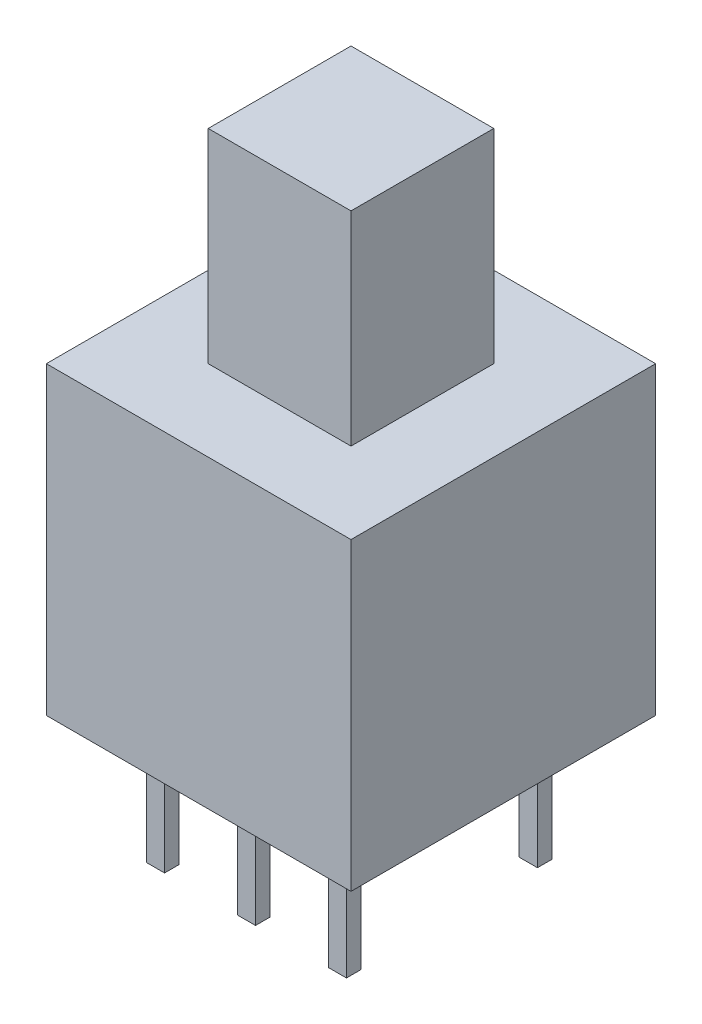
ISO-10303-21;
HEADER;
FILE_DESCRIPTION(('STEP AP214'),'2;1');
FILE_NAME('part.step','',(''),(''),'','','');
FILE_SCHEMA(('AUTOMOTIVE_DESIGN { 1 0 10303 214 1 1 1 1 }'));
ENDSEC;
DATA;
#1=APPLICATION_CONTEXT('core data for automotive mechanical design processes');
#2=APPLICATION_PROTOCOL_DEFINITION('international standard','automotive_design',2000,#1);
#3=PRODUCT_CONTEXT('',#1,'mechanical');
#4=PRODUCT('Part','Part','',(#3));
#5=PRODUCT_RELATED_PRODUCT_CATEGORY('part','',(#4));
#6=PRODUCT_DEFINITION_FORMATION('','',#4);
#7=PRODUCT_DEFINITION_CONTEXT('part definition',#1,'design');
#8=PRODUCT_DEFINITION('design','',#6,#7);
#9=PRODUCT_DEFINITION_SHAPE('','',#8);
#10=(LENGTH_UNIT() NAMED_UNIT(*) SI_UNIT(.MILLI.,.METRE.));
#11=(NAMED_UNIT(*) PLANE_ANGLE_UNIT() SI_UNIT($,.RADIAN.));
#12=(NAMED_UNIT(*) SI_UNIT($,.STERADIAN.) SOLID_ANGLE_UNIT());
#13=UNCERTAINTY_MEASURE_WITH_UNIT(LENGTH_MEASURE(1.E-05),#10,'distance_accuracy_value','');
#14=(GEOMETRIC_REPRESENTATION_CONTEXT(3) GLOBAL_UNCERTAINTY_ASSIGNED_CONTEXT((#13)) GLOBAL_UNIT_ASSIGNED_CONTEXT((#10,
#11,#12)) REPRESENTATION_CONTEXT('',''));
#15=CARTESIAN_POINT('',(0.,0.,0.));
#16=DIRECTION('',(0.,0.,1.));
#17=DIRECTION('',(1.,0.,0.));
#18=AXIS2_PLACEMENT_3D('',#15,#16,#17);
#19=CARTESIAN_POINT('',(0.,0.,0.));
#20=DIRECTION('',(0.,-1.,0.));
#21=DIRECTION('',(0.,0.,-1.));
#22=AXIS2_PLACEMENT_3D('',#19,#20,#21);
#23=PLANE('',#22);
#24=DIRECTION('',(0.,0.,1.));
#25=VECTOR('',#24,1.);
#26=CARTESIAN_POINT('',(0.,0.,0.));
#27=LINE('',#26,#25);
#28=CARTESIAN_POINT('',(0.,0.,-8.509));
#29=VERTEX_POINT('',#28);
#30=CARTESIAN_POINT('',(0.,0.,0.));
#31=VERTEX_POINT('',#30);
#32=EDGE_CURVE('E448',#29,#31,#27,.T.);
#33=ORIENTED_EDGE('',*,*,#32,.F.);
#34=DIRECTION('',(-1.,0.,0.));
#35=VECTOR('',#34,1.);
#36=CARTESIAN_POINT('',(0.,0.,-8.509));
#37=LINE('',#36,#35);
#38=CARTESIAN_POINT('',(8.509,0.,-8.509));
#39=VERTEX_POINT('',#38);
#40=EDGE_CURVE('E453',#39,#29,#37,.T.);
#41=ORIENTED_EDGE('',*,*,#40,.F.);
#42=DIRECTION('',(0.,0.,-1.));
#43=VECTOR('',#42,1.);
#44=CARTESIAN_POINT('',(8.509,0.,0.));
#45=LINE('',#44,#43);
#46=CARTESIAN_POINT('',(8.509,0.,0.));
#47=VERTEX_POINT('',#46);
#48=EDGE_CURVE('E464',#47,#39,#45,.T.);
#49=ORIENTED_EDGE('',*,*,#48,.F.);
#50=DIRECTION('',(1.,0.,0.));
#51=VECTOR('',#50,1.);
#52=CARTESIAN_POINT('',(0.,0.,0.));
#53=LINE('',#52,#51);
#54=EDGE_CURVE('E462',#31,#47,#53,.T.);
#55=ORIENTED_EDGE('',*,*,#54,.F.);
#56=EDGE_LOOP('',(#33,#41,#49,#55));
#57=FACE_BOUND('',#56,.T.);
#58=DIRECTION('',(1.,0.,0.));
#59=VECTOR('',#58,1.);
#60=CARTESIAN_POINT('',(1.4478,0.,-1.7526));
#61=LINE('',#60,#59);
#62=CARTESIAN_POINT('',(1.4478,0.,-1.7526));
#63=VERTEX_POINT('',#62);
#64=CARTESIAN_POINT('',(1.9558,0.,-1.7526));
#65=VERTEX_POINT('',#64);
#66=EDGE_CURVE('E400',#63,#65,#61,.T.);
#67=ORIENTED_EDGE('',*,*,#66,.F.);
#68=DIRECTION('',(0.,0.,-1.));
#69=VECTOR('',#68,1.);
#70=CARTESIAN_POINT('',(1.4478,0.,-1.3462));
#71=LINE('',#70,#69);
#72=CARTESIAN_POINT('',(1.4478,0.,-1.3462));
#73=VERTEX_POINT('',#72);
#74=EDGE_CURVE('E386',#73,#63,#71,.T.);
#75=ORIENTED_EDGE('',*,*,#74,.F.);
#76=DIRECTION('',(-1.,0.,0.));
#77=VECTOR('',#76,1.);
#78=CARTESIAN_POINT('',(1.4478,0.,-1.3462));
#79=LINE('',#78,#77);
#80=CARTESIAN_POINT('',(1.9558,0.,-1.3462));
#81=VERTEX_POINT('',#80);
#82=EDGE_CURVE('E391',#81,#73,#79,.T.);
#83=ORIENTED_EDGE('',*,*,#82,.F.);
#84=DIRECTION('',(0.,0.,1.));
#85=VECTOR('',#84,1.);
#86=CARTESIAN_POINT('',(1.9558,0.,-1.3462));
#87=LINE('',#86,#85);
#88=EDGE_CURVE('E402',#65,#81,#87,.T.);
#89=ORIENTED_EDGE('',*,*,#88,.F.);
#90=EDGE_LOOP('',(#67,#75,#83,#89));
#91=FACE_BOUND('',#90,.T.);
#92=DIRECTION('',(0.,0.,-1.));
#93=VECTOR('',#92,1.);
#94=CARTESIAN_POINT('',(1.4478,0.,-6.6802));
#95=LINE('',#94,#93);
#96=CARTESIAN_POINT('',(1.4478,0.,-6.6802));
#97=VERTEX_POINT('',#96);
#98=CARTESIAN_POINT('',(1.4478,0.,-7.0866));
#99=VERTEX_POINT('',#98);
#100=EDGE_CURVE('E371',#97,#99,#95,.T.);
#101=ORIENTED_EDGE('',*,*,#100,.F.);
#102=DIRECTION('',(-1.,0.,0.));
#103=VECTOR('',#102,1.);
#104=CARTESIAN_POINT('',(1.4478,0.,-6.6802));
#105=LINE('',#104,#103);
#106=CARTESIAN_POINT('',(1.9558,0.,-6.6802));
#107=VERTEX_POINT('',#106);
#108=EDGE_CURVE('E357',#107,#97,#105,.T.);
#109=ORIENTED_EDGE('',*,*,#108,.F.);
#110=DIRECTION('',(0.,0.,1.));
#111=VECTOR('',#110,1.);
#112=CARTESIAN_POINT('',(1.9558,0.,-6.6802));
#113=LINE('',#112,#111);
#114=CARTESIAN_POINT('',(1.9558,0.,-7.0866));
#115=VERTEX_POINT('',#114);
#116=EDGE_CURVE('E362',#115,#107,#113,.T.);
#117=ORIENTED_EDGE('',*,*,#116,.F.);
#118=DIRECTION('',(1.,0.,0.));
#119=VECTOR('',#118,1.);
#120=CARTESIAN_POINT('',(1.4478,0.,-7.0866));
#121=LINE('',#120,#119);
#122=EDGE_CURVE('E373',#99,#115,#121,.T.);
#123=ORIENTED_EDGE('',*,*,#122,.F.);
#124=EDGE_LOOP('',(#101,#109,#117,#123));
#125=FACE_BOUND('',#124,.T.);
#126=DIRECTION('',(0.,0.,-1.));
#127=VECTOR('',#126,1.);
#128=CARTESIAN_POINT('',(3.9878,0.,-6.6802));
#129=LINE('',#128,#127);
#130=CARTESIAN_POINT('',(3.9878,0.,-6.6802));
#131=VERTEX_POINT('',#130);
#132=CARTESIAN_POINT('',(3.9878,0.,-7.0866));
#133=VERTEX_POINT('',#132);
#134=EDGE_CURVE('E342',#131,#133,#129,.T.);
#135=ORIENTED_EDGE('',*,*,#134,.F.);
#136=DIRECTION('',(-1.,0.,0.));
#137=VECTOR('',#136,1.);
#138=CARTESIAN_POINT('',(3.9878,0.,-6.6802));
#139=LINE('',#138,#137);
#140=CARTESIAN_POINT('',(4.4958,0.,-6.6802));
#141=VERTEX_POINT('',#140);
#142=EDGE_CURVE('E328',#141,#131,#139,.T.);
#143=ORIENTED_EDGE('',*,*,#142,.F.);
#144=DIRECTION('',(0.,0.,1.));
#145=VECTOR('',#144,1.);
#146=CARTESIAN_POINT('',(4.4958,0.,-6.6802));
#147=LINE('',#146,#145);
#148=CARTESIAN_POINT('',(4.4958,0.,-7.0866));
#149=VERTEX_POINT('',#148);
#150=EDGE_CURVE('E333',#149,#141,#147,.T.);
#151=ORIENTED_EDGE('',*,*,#150,.F.);
#152=DIRECTION('',(1.,0.,0.));
#153=VECTOR('',#152,1.);
#154=CARTESIAN_POINT('',(3.9878,0.,-7.0866));
#155=LINE('',#154,#153);
#156=EDGE_CURVE('E344',#133,#149,#155,.T.);
#157=ORIENTED_EDGE('',*,*,#156,.F.);
#158=EDGE_LOOP('',(#135,#143,#151,#157));
#159=FACE_BOUND('',#158,.T.);
#160=DIRECTION('',(0.,0.,-1.));
#161=VECTOR('',#160,1.);
#162=CARTESIAN_POINT('',(6.5278,0.,-6.6802));
#163=LINE('',#162,#161);
#164=CARTESIAN_POINT('',(6.5278,0.,-6.6802));
#165=VERTEX_POINT('',#164);
#166=CARTESIAN_POINT('',(6.5278,0.,-7.0866));
#167=VERTEX_POINT('',#166);
#168=EDGE_CURVE('E313',#165,#167,#163,.T.);
#169=ORIENTED_EDGE('',*,*,#168,.F.);
#170=DIRECTION('',(-1.,0.,0.));
#171=VECTOR('',#170,1.);
#172=CARTESIAN_POINT('',(6.5278,0.,-6.6802));
#173=LINE('',#172,#171);
#174=CARTESIAN_POINT('',(7.0358,0.,-6.6802));
#175=VERTEX_POINT('',#174);
#176=EDGE_CURVE('E299',#175,#165,#173,.T.);
#177=ORIENTED_EDGE('',*,*,#176,.F.);
#178=DIRECTION('',(0.,0.,1.));
#179=VECTOR('',#178,1.);
#180=CARTESIAN_POINT('',(7.0358,0.,-6.6802));
#181=LINE('',#180,#179);
#182=CARTESIAN_POINT('',(7.0358,0.,-7.0866));
#183=VERTEX_POINT('',#182);
#184=EDGE_CURVE('E304',#183,#175,#181,.T.);
#185=ORIENTED_EDGE('',*,*,#184,.F.);
#186=DIRECTION('',(1.,0.,0.));
#187=VECTOR('',#186,1.);
#188=CARTESIAN_POINT('',(6.5278,0.,-7.0866));
#189=LINE('',#188,#187);
#190=EDGE_CURVE('E315',#167,#183,#189,.T.);
#191=ORIENTED_EDGE('',*,*,#190,.F.);
#192=EDGE_LOOP('',(#169,#177,#185,#191));
#193=FACE_BOUND('',#192,.T.);
#194=DIRECTION('',(0.,0.,-1.));
#195=VECTOR('',#194,1.);
#196=CARTESIAN_POINT('',(3.9878,0.,-1.3462));
#197=LINE('',#196,#195);
#198=CARTESIAN_POINT('',(3.9878,0.,-1.3462));
#199=VERTEX_POINT('',#198);
#200=CARTESIAN_POINT('',(3.9878,0.,-1.7526));
#201=VERTEX_POINT('',#200);
#202=EDGE_CURVE('E271',#199,#201,#197,.T.);
#203=ORIENTED_EDGE('',*,*,#202,.F.);
#204=DIRECTION('',(-1.,0.,0.));
#205=VECTOR('',#204,1.);
#206=CARTESIAN_POINT('',(3.9878,0.,-1.3462));
#207=LINE('',#206,#205);
#208=CARTESIAN_POINT('',(4.4958,0.,-1.3462));
#209=VERTEX_POINT('',#208);
#210=EDGE_CURVE('E268',#209,#199,#207,.T.);
#211=ORIENTED_EDGE('',*,*,#210,.F.);
#212=DIRECTION('',(0.,0.,1.));
#213=VECTOR('',#212,1.);
#214=CARTESIAN_POINT('',(4.4958,0.,-1.3462));
#215=LINE('',#214,#213);
#216=CARTESIAN_POINT('',(4.4958,0.,-1.7526));
#217=VERTEX_POINT('',#216);
#218=EDGE_CURVE('E280',#217,#209,#215,.T.);
#219=ORIENTED_EDGE('',*,*,#218,.F.);
#220=DIRECTION('',(1.,0.,0.));
#221=VECTOR('',#220,1.);
#222=CARTESIAN_POINT('',(3.9878,0.,-1.7526));
#223=LINE('',#222,#221);
#224=EDGE_CURVE('E288',#201,#217,#223,.T.);
#225=ORIENTED_EDGE('',*,*,#224,.F.);
#226=EDGE_LOOP('',(#203,#211,#219,#225));
#227=FACE_BOUND('',#226,.T.);
#228=DIRECTION('',(0.,0.,-1.));
#229=VECTOR('',#228,1.);
#230=CARTESIAN_POINT('',(6.5278,0.,-1.3462));
#231=LINE('',#230,#229);
#232=CARTESIAN_POINT('',(6.5278,0.,-1.3462));
#233=VERTEX_POINT('',#232);
#234=CARTESIAN_POINT('',(6.5278,0.,-1.7526));
#235=VERTEX_POINT('',#234);
#236=EDGE_CURVE('E889',#233,#235,#231,.T.);
#237=ORIENTED_EDGE('',*,*,#236,.F.);
#238=DIRECTION('',(-1.,0.,0.));
#239=VECTOR('',#238,1.);
#240=CARTESIAN_POINT('',(6.5278,0.,-1.3462));
#241=LINE('',#240,#239);
#242=CARTESIAN_POINT('',(7.0358,0.,-1.3462));
#243=VERTEX_POINT('',#242);
#244=EDGE_CURVE('E266',#243,#233,#241,.T.);
#245=ORIENTED_EDGE('',*,*,#244,.F.);
#246=DIRECTION('',(0.,0.,1.));
#247=VECTOR('',#246,1.);
#248=CARTESIAN_POINT('',(7.0358,0.,-1.3462));
#249=LINE('',#248,#247);
#250=CARTESIAN_POINT('',(7.0358,0.,-1.7526));
#251=VERTEX_POINT('',#250);
#252=EDGE_CURVE('E262',#251,#243,#249,.T.);
#253=ORIENTED_EDGE('',*,*,#252,.F.);
#254=DIRECTION('',(1.,0.,0.));
#255=VECTOR('',#254,1.);
#256=CARTESIAN_POINT('',(6.5278,0.,-1.7526));
#257=LINE('',#256,#255);
#258=EDGE_CURVE('E886',#235,#251,#257,.T.);
#259=ORIENTED_EDGE('',*,*,#258,.F.);
#260=EDGE_LOOP('',(#237,#245,#253,#259));
#261=FACE_BOUND('',#260,.T.);
#262=ADVANCED_FACE('F33',(#57,#91,#125,#159,#193,#227,#261),#23,.T.);
#263=CARTESIAN_POINT('',(0.,8.509,0.));
#264=DIRECTION('',(0.,-1.,0.));
#265=DIRECTION('',(0.,0.,-1.));
#266=AXIS2_PLACEMENT_3D('',#263,#264,#265);
#267=PLANE('',#266);
#268=DIRECTION('',(0.,0.,1.));
#269=VECTOR('',#268,1.);
#270=CARTESIAN_POINT('',(0.,8.509,0.));
#271=LINE('',#270,#269);
#272=CARTESIAN_POINT('',(0.,8.509,-8.509));
#273=VERTEX_POINT('',#272);
#274=CARTESIAN_POINT('',(0.,8.509,0.));
#275=VERTEX_POINT('',#274);
#276=EDGE_CURVE('E449',#273,#275,#271,.T.);
#277=ORIENTED_EDGE('',*,*,#276,.T.);
#278=DIRECTION('',(1.,0.,0.));
#279=VECTOR('',#278,1.);
#280=CARTESIAN_POINT('',(0.,8.509,0.));
#281=LINE('',#280,#279);
#282=CARTESIAN_POINT('',(8.509,8.509,0.));
#283=VERTEX_POINT('',#282);
#284=EDGE_CURVE('E452',#275,#283,#281,.T.);
#285=ORIENTED_EDGE('',*,*,#284,.T.);
#286=DIRECTION('',(0.,0.,-1.));
#287=VECTOR('',#286,1.);
#288=CARTESIAN_POINT('',(8.509,8.509,0.));
#289=LINE('',#288,#287);
#290=CARTESIAN_POINT('',(8.509,8.509,-8.509));
#291=VERTEX_POINT('',#290);
#292=EDGE_CURVE('E455',#283,#291,#289,.T.);
#293=ORIENTED_EDGE('',*,*,#292,.T.);
#294=DIRECTION('',(-1.,0.,0.));
#295=VECTOR('',#294,1.);
#296=CARTESIAN_POINT('',(0.,8.509,-8.509));
#297=LINE('',#296,#295);
#298=EDGE_CURVE('E457',#291,#273,#297,.T.);
#299=ORIENTED_EDGE('',*,*,#298,.T.);
#300=EDGE_LOOP('',(#277,#285,#293,#299));
#301=FACE_BOUND('',#300,.T.);
#302=DIRECTION('',(0.,0.,1.));
#303=VECTOR('',#302,1.);
#304=CARTESIAN_POINT('',(2.2606,8.509,-6.2484));
#305=LINE('',#304,#303);
#306=CARTESIAN_POINT('',(2.2606,8.509,-6.2484));
#307=VERTEX_POINT('',#306);
#308=CARTESIAN_POINT('',(2.2606,8.509,-2.2606));
#309=VERTEX_POINT('',#308);
#310=EDGE_CURVE('E415',#307,#309,#305,.T.);
#311=ORIENTED_EDGE('',*,*,#310,.F.);
#312=DIRECTION('',(-1.,0.,0.));
#313=VECTOR('',#312,1.);
#314=CARTESIAN_POINT('',(2.2606,8.509,-6.2484));
#315=LINE('',#314,#313);
#316=CARTESIAN_POINT('',(6.2484,8.509,-6.2484));
#317=VERTEX_POINT('',#316);
#318=EDGE_CURVE('E420',#317,#307,#315,.T.);
#319=ORIENTED_EDGE('',*,*,#318,.F.);
#320=DIRECTION('',(0.,0.,-1.));
#321=VECTOR('',#320,1.);
#322=CARTESIAN_POINT('',(6.2484,8.509,-6.2484));
#323=LINE('',#322,#321);
#324=CARTESIAN_POINT('',(6.2484,8.509,-2.2606));
#325=VERTEX_POINT('',#324);
#326=EDGE_CURVE('E432',#325,#317,#323,.T.);
#327=ORIENTED_EDGE('',*,*,#326,.F.);
#328=DIRECTION('',(1.,0.,0.));
#329=VECTOR('',#328,1.);
#330=CARTESIAN_POINT('',(2.2606,8.509,-2.2606));
#331=LINE('',#330,#329);
#332=EDGE_CURVE('E429',#309,#325,#331,.T.);
#333=ORIENTED_EDGE('',*,*,#332,.F.);
#334=EDGE_LOOP('',(#311,#319,#327,#333));
#335=FACE_BOUND('',#334,.T.);
#336=ADVANCED_FACE('F491',(#301,#335),#267,.F.);
#337=CARTESIAN_POINT('',(0.,8.509,0.));
#338=DIRECTION('',(1.,0.,0.));
#339=DIRECTION('',(0.,0.,-1.));
#340=AXIS2_PLACEMENT_3D('',#337,#338,#339);
#341=PLANE('',#340);
#342=ORIENTED_EDGE('',*,*,#32,.T.);
#343=DIRECTION('',(0.,-1.,0.));
#344=VECTOR('',#343,1.);
#345=CARTESIAN_POINT('',(0.,8.509,0.));
#346=LINE('',#345,#344);
#347=EDGE_CURVE('E11',#275,#31,#346,.T.);
#348=ORIENTED_EDGE('',*,*,#347,.F.);
#349=ORIENTED_EDGE('',*,*,#276,.F.);
#350=DIRECTION('',(0.,-1.,0.));
#351=VECTOR('',#350,1.);
#352=CARTESIAN_POINT('',(0.,8.509,-8.509));
#353=LINE('',#352,#351);
#354=EDGE_CURVE('E459',#273,#29,#353,.T.);
#355=ORIENTED_EDGE('',*,*,#354,.T.);
#356=EDGE_LOOP('',(#342,#348,#349,#355));
#357=FACE_BOUND('',#356,.T.);
#358=ADVANCED_FACE('F35',(#357),#341,.F.);
#359=CARTESIAN_POINT('',(0.,8.509,0.));
#360=DIRECTION('',(0.,0.,-1.));
#361=DIRECTION('',(-1.,0.,0.));
#362=AXIS2_PLACEMENT_3D('',#359,#360,#361);
#363=PLANE('',#362);
#364=ORIENTED_EDGE('',*,*,#54,.T.);
#365=DIRECTION('',(0.,-1.,0.));
#366=VECTOR('',#365,1.);
#367=CARTESIAN_POINT('',(8.509,8.509,0.));
#368=LINE('',#367,#366);
#369=EDGE_CURVE('E41',#283,#47,#368,.T.);
#370=ORIENTED_EDGE('',*,*,#369,.F.);
#371=ORIENTED_EDGE('',*,*,#284,.F.);
#372=ORIENTED_EDGE('',*,*,#347,.T.);
#373=EDGE_LOOP('',(#364,#370,#371,#372));
#374=FACE_BOUND('',#373,.T.);
#375=ADVANCED_FACE('F493',(#374),#363,.F.);
#376=CARTESIAN_POINT('',(8.509,8.509,0.));
#377=DIRECTION('',(-1.,0.,0.));
#378=DIRECTION('',(0.,0.,1.));
#379=AXIS2_PLACEMENT_3D('',#376,#377,#378);
#380=PLANE('',#379);
#381=ORIENTED_EDGE('',*,*,#48,.T.);
#382=DIRECTION('',(0.,-1.,0.));
#383=VECTOR('',#382,1.);
#384=CARTESIAN_POINT('',(8.509,8.509,-8.509));
#385=LINE('',#384,#383);
#386=EDGE_CURVE('E469',#291,#39,#385,.T.);
#387=ORIENTED_EDGE('',*,*,#386,.F.);
#388=ORIENTED_EDGE('',*,*,#292,.F.);
#389=ORIENTED_EDGE('',*,*,#369,.T.);
#390=EDGE_LOOP('',(#381,#387,#388,#389));
#391=FACE_BOUND('',#390,.T.);
#392=ADVANCED_FACE('F476',(#391),#380,.F.);
#393=CARTESIAN_POINT('',(0.,8.509,-8.509));
#394=DIRECTION('',(0.,0.,1.));
#395=DIRECTION('',(1.,0.,0.));
#396=AXIS2_PLACEMENT_3D('',#393,#394,#395);
#397=PLANE('',#396);
#398=ORIENTED_EDGE('',*,*,#40,.T.);
#399=ORIENTED_EDGE('',*,*,#354,.F.);
#400=ORIENTED_EDGE('',*,*,#298,.F.);
#401=ORIENTED_EDGE('',*,*,#386,.T.);
#402=EDGE_LOOP('',(#398,#399,#400,#401));
#403=FACE_BOUND('',#402,.T.);
#404=ADVANCED_FACE('F485',(#403),#397,.F.);
#405=CARTESIAN_POINT('',(2.2606,14.1986,-6.2484));
#406=DIRECTION('',(1.,0.,0.));
#407=DIRECTION('',(0.,0.,-1.));
#408=AXIS2_PLACEMENT_3D('',#405,#406,#407);
#409=PLANE('',#408);
#410=ORIENTED_EDGE('',*,*,#310,.T.);
#411=DIRECTION('',(0.,-1.,0.));
#412=VECTOR('',#411,1.);
#413=CARTESIAN_POINT('',(2.2606,14.1986,-2.2606));
#414=LINE('',#413,#412);
#415=CARTESIAN_POINT('',(2.2606,14.1986,-2.2606));
#416=VERTEX_POINT('',#415);
#417=EDGE_CURVE('E445',#416,#309,#414,.T.);
#418=ORIENTED_EDGE('',*,*,#417,.F.);
#419=DIRECTION('',(0.,0.,1.));
#420=VECTOR('',#419,1.);
#421=CARTESIAN_POINT('',(2.2606,14.1986,-6.2484));
#422=LINE('',#421,#420);
#423=CARTESIAN_POINT('',(2.2606,14.1986,-6.2484));
#424=VERTEX_POINT('',#423);
#425=EDGE_CURVE('E416',#424,#416,#422,.T.);
#426=ORIENTED_EDGE('',*,*,#425,.F.);
#427=DIRECTION('',(0.,-1.,0.));
#428=VECTOR('',#427,1.);
#429=CARTESIAN_POINT('',(2.2606,14.1986,-6.2484));
#430=LINE('',#429,#428);
#431=EDGE_CURVE('E426',#424,#307,#430,.T.);
#432=ORIENTED_EDGE('',*,*,#431,.T.);
#433=EDGE_LOOP('',(#410,#418,#426,#432));
#434=FACE_BOUND('',#433,.T.);
#435=ADVANCED_FACE('F509',(#434),#409,.F.);
#436=CARTESIAN_POINT('',(2.2606,14.1986,-2.2606));
#437=DIRECTION('',(0.,0.,-1.));
#438=DIRECTION('',(-1.,0.,0.));
#439=AXIS2_PLACEMENT_3D('',#436,#437,#438);
#440=PLANE('',#439);
#441=ORIENTED_EDGE('',*,*,#332,.T.);
#442=DIRECTION('',(0.,-1.,0.));
#443=VECTOR('',#442,1.);
#444=CARTESIAN_POINT('',(6.2484,14.1986,-2.2606));
#445=LINE('',#444,#443);
#446=CARTESIAN_POINT('',(6.2484,14.1986,-2.2606));
#447=VERTEX_POINT('',#446);
#448=EDGE_CURVE('E442',#447,#325,#445,.T.);
#449=ORIENTED_EDGE('',*,*,#448,.F.);
#450=DIRECTION('',(1.,0.,0.));
#451=VECTOR('',#450,1.);
#452=CARTESIAN_POINT('',(2.2606,14.1986,-2.2606));
#453=LINE('',#452,#451);
#454=EDGE_CURVE('E419',#416,#447,#453,.T.);
#455=ORIENTED_EDGE('',*,*,#454,.F.);
#456=ORIENTED_EDGE('',*,*,#417,.T.);
#457=EDGE_LOOP('',(#441,#449,#455,#456));
#458=FACE_BOUND('',#457,.T.);
#459=ADVANCED_FACE('F513',(#458),#440,.F.);
#460=CARTESIAN_POINT('',(6.2484,14.1986,-6.2484));
#461=DIRECTION('',(-1.,0.,0.));
#462=DIRECTION('',(0.,0.,1.));
#463=AXIS2_PLACEMENT_3D('',#460,#461,#462);
#464=PLANE('',#463);
#465=ORIENTED_EDGE('',*,*,#326,.T.);
#466=DIRECTION('',(0.,-1.,0.));
#467=VECTOR('',#466,1.);
#468=CARTESIAN_POINT('',(6.2484,14.1986,-6.2484));
#469=LINE('',#468,#467);
#470=CARTESIAN_POINT('',(6.2484,14.1986,-6.2484));
#471=VERTEX_POINT('',#470);
#472=EDGE_CURVE('E439',#471,#317,#469,.T.);
#473=ORIENTED_EDGE('',*,*,#472,.F.);
#474=DIRECTION('',(0.,0.,-1.));
#475=VECTOR('',#474,1.);
#476=CARTESIAN_POINT('',(6.2484,14.1986,-6.2484));
#477=LINE('',#476,#475);
#478=EDGE_CURVE('E422',#447,#471,#477,.T.);
#479=ORIENTED_EDGE('',*,*,#478,.F.);
#480=ORIENTED_EDGE('',*,*,#448,.T.);
#481=EDGE_LOOP('',(#465,#473,#479,#480));
#482=FACE_BOUND('',#481,.T.);
#483=ADVANCED_FACE('F518',(#482),#464,.F.);
#484=CARTESIAN_POINT('',(2.2606,14.1986,-6.2484));
#485=DIRECTION('',(0.,0.,1.));
#486=DIRECTION('',(1.,0.,0.));
#487=AXIS2_PLACEMENT_3D('',#484,#485,#486);
#488=PLANE('',#487);
#489=ORIENTED_EDGE('',*,*,#318,.T.);
#490=ORIENTED_EDGE('',*,*,#431,.F.);
#491=DIRECTION('',(-1.,0.,0.));
#492=VECTOR('',#491,1.);
#493=CARTESIAN_POINT('',(2.2606,14.1986,-6.2484));
#494=LINE('',#493,#492);
#495=EDGE_CURVE('E424',#471,#424,#494,.T.);
#496=ORIENTED_EDGE('',*,*,#495,.F.);
#497=ORIENTED_EDGE('',*,*,#472,.T.);
#498=EDGE_LOOP('',(#489,#490,#496,#497));
#499=FACE_BOUND('',#498,.T.);
#500=ADVANCED_FACE('F524',(#499),#488,.F.);
#501=CARTESIAN_POINT('',(0.,14.1986,0.));
#502=DIRECTION('',(0.,1.,0.));
#503=DIRECTION('',(0.,0.,1.));
#504=AXIS2_PLACEMENT_3D('',#501,#502,#503);
#505=PLANE('',#504);
#506=ORIENTED_EDGE('',*,*,#425,.T.);
#507=ORIENTED_EDGE('',*,*,#454,.T.);
#508=ORIENTED_EDGE('',*,*,#478,.T.);
#509=ORIENTED_EDGE('',*,*,#495,.T.);
#510=EDGE_LOOP('',(#506,#507,#508,#509));
#511=FACE_BOUND('',#510,.T.);
#512=ADVANCED_FACE('F528',(#511),#505,.T.);
#513=CARTESIAN_POINT('',(1.4478,-3.5052,-1.3462));
#514=DIRECTION('',(1.,0.,0.));
#515=DIRECTION('',(0.,0.,-1.));
#516=AXIS2_PLACEMENT_3D('',#513,#514,#515);
#517=PLANE('',#516);
#518=ORIENTED_EDGE('',*,*,#74,.T.);
#519=DIRECTION('',(0.,1.,0.));
#520=VECTOR('',#519,1.);
#521=CARTESIAN_POINT('',(1.4478,-3.5052,-1.7526));
#522=LINE('',#521,#520);
#523=CARTESIAN_POINT('',(1.4478,-3.5052,-1.7526));
#524=VERTEX_POINT('',#523);
#525=EDGE_CURVE('E413',#524,#63,#522,.T.);
#526=ORIENTED_EDGE('',*,*,#525,.F.);
#527=DIRECTION('',(0.,0.,-1.));
#528=VECTOR('',#527,1.);
#529=CARTESIAN_POINT('',(1.4478,-3.5052,-1.3462));
#530=LINE('',#529,#528);
#531=CARTESIAN_POINT('',(1.4478,-3.5052,-1.3462));
#532=VERTEX_POINT('',#531);
#533=EDGE_CURVE('E387',#532,#524,#530,.T.);
#534=ORIENTED_EDGE('',*,*,#533,.F.);
#535=DIRECTION('',(0.,1.,0.));
#536=VECTOR('',#535,1.);
#537=CARTESIAN_POINT('',(1.4478,-3.5052,-1.3462));
#538=LINE('',#537,#536);
#539=EDGE_CURVE('E397',#532,#73,#538,.T.);
#540=ORIENTED_EDGE('',*,*,#539,.T.);
#541=EDGE_LOOP('',(#518,#526,#534,#540));
#542=FACE_BOUND('',#541,.T.);
#543=ADVANCED_FACE('F532',(#542),#517,.F.);
#544=CARTESIAN_POINT('',(1.4478,-3.5052,-1.7526));
#545=DIRECTION('',(0.,0.,1.));
#546=DIRECTION('',(1.,0.,0.));
#547=AXIS2_PLACEMENT_3D('',#544,#545,#546);
#548=PLANE('',#547);
#549=ORIENTED_EDGE('',*,*,#66,.T.);
#550=DIRECTION('',(0.,1.,0.));
#551=VECTOR('',#550,1.);
#552=CARTESIAN_POINT('',(1.9558,-3.5052,-1.7526));
#553=LINE('',#552,#551);
#554=CARTESIAN_POINT('',(1.9558,-3.5052,-1.7526));
#555=VERTEX_POINT('',#554);
#556=EDGE_CURVE('E410',#555,#65,#553,.T.);
#557=ORIENTED_EDGE('',*,*,#556,.F.);
#558=DIRECTION('',(1.,0.,0.));
#559=VECTOR('',#558,1.);
#560=CARTESIAN_POINT('',(1.4478,-3.5052,-1.7526));
#561=LINE('',#560,#559);
#562=EDGE_CURVE('E390',#524,#555,#561,.T.);
#563=ORIENTED_EDGE('',*,*,#562,.F.);
#564=ORIENTED_EDGE('',*,*,#525,.T.);
#565=EDGE_LOOP('',(#549,#557,#563,#564));
#566=FACE_BOUND('',#565,.T.);
#567=ADVANCED_FACE('F536',(#566),#548,.F.);
#568=CARTESIAN_POINT('',(1.9558,-3.5052,-1.3462));
#569=DIRECTION('',(-1.,0.,0.));
#570=DIRECTION('',(0.,0.,1.));
#571=AXIS2_PLACEMENT_3D('',#568,#569,#570);
#572=PLANE('',#571);
#573=ORIENTED_EDGE('',*,*,#88,.T.);
#574=DIRECTION('',(0.,1.,0.));
#575=VECTOR('',#574,1.);
#576=CARTESIAN_POINT('',(1.9558,-3.5052,-1.3462));
#577=LINE('',#576,#575);
#578=CARTESIAN_POINT('',(1.9558,-3.5052,-1.3462));
#579=VERTEX_POINT('',#578);
#580=EDGE_CURVE('E408',#579,#81,#577,.T.);
#581=ORIENTED_EDGE('',*,*,#580,.F.);
#582=DIRECTION('',(0.,0.,1.));
#583=VECTOR('',#582,1.);
#584=CARTESIAN_POINT('',(1.9558,-3.5052,-1.3462));
#585=LINE('',#584,#583);
#586=EDGE_CURVE('E393',#555,#579,#585,.T.);
#587=ORIENTED_EDGE('',*,*,#586,.F.);
#588=ORIENTED_EDGE('',*,*,#556,.T.);
#589=EDGE_LOOP('',(#573,#581,#587,#588));
#590=FACE_BOUND('',#589,.T.);
#591=ADVANCED_FACE('F540',(#590),#572,.F.);
#592=CARTESIAN_POINT('',(1.4478,-3.5052,-1.3462));
#593=DIRECTION('',(0.,0.,-1.));
#594=DIRECTION('',(-1.,0.,0.));
#595=AXIS2_PLACEMENT_3D('',#592,#593,#594);
#596=PLANE('',#595);
#597=ORIENTED_EDGE('',*,*,#82,.T.);
#598=ORIENTED_EDGE('',*,*,#539,.F.);
#599=DIRECTION('',(-1.,0.,0.));
#600=VECTOR('',#599,1.);
#601=CARTESIAN_POINT('',(1.4478,-3.5052,-1.3462));
#602=LINE('',#601,#600);
#603=EDGE_CURVE('E395',#579,#532,#602,.T.);
#604=ORIENTED_EDGE('',*,*,#603,.F.);
#605=ORIENTED_EDGE('',*,*,#580,.T.);
#606=EDGE_LOOP('',(#597,#598,#604,#605));
#607=FACE_BOUND('',#606,.T.);
#608=ADVANCED_FACE('F544',(#607),#596,.F.);
#609=CARTESIAN_POINT('',(0.,-3.5052,0.));
#610=DIRECTION('',(0.,-1.,0.));
#611=DIRECTION('',(0.,0.,-1.));
#612=AXIS2_PLACEMENT_3D('',#609,#610,#611);
#613=PLANE('',#612);
#614=ORIENTED_EDGE('',*,*,#533,.T.);
#615=ORIENTED_EDGE('',*,*,#562,.T.);
#616=ORIENTED_EDGE('',*,*,#586,.T.);
#617=ORIENTED_EDGE('',*,*,#603,.T.);
#618=EDGE_LOOP('',(#614,#615,#616,#617));
#619=FACE_BOUND('',#618,.T.);
#620=ADVANCED_FACE('F548',(#619),#613,.T.);
#621=CARTESIAN_POINT('',(1.4478,-3.5052,-6.6802));
#622=DIRECTION('',(0.,0.,-1.));
#623=DIRECTION('',(-1.,0.,0.));
#624=AXIS2_PLACEMENT_3D('',#621,#622,#623);
#625=PLANE('',#624);
#626=ORIENTED_EDGE('',*,*,#108,.T.);
#627=DIRECTION('',(0.,1.,0.));
#628=VECTOR('',#627,1.);
#629=CARTESIAN_POINT('',(1.4478,-3.5052,-6.6802));
#630=LINE('',#629,#628);
#631=CARTESIAN_POINT('',(1.4478,-3.5052,-6.6802));
#632=VERTEX_POINT('',#631);
#633=EDGE_CURVE('E384',#632,#97,#630,.T.);
#634=ORIENTED_EDGE('',*,*,#633,.F.);
#635=DIRECTION('',(-1.,0.,0.));
#636=VECTOR('',#635,1.);
#637=CARTESIAN_POINT('',(1.4478,-3.5052,-6.6802));
#638=LINE('',#637,#636);
#639=CARTESIAN_POINT('',(1.9558,-3.5052,-6.6802));
#640=VERTEX_POINT('',#639);
#641=EDGE_CURVE('E358',#640,#632,#638,.T.);
#642=ORIENTED_EDGE('',*,*,#641,.F.);
#643=DIRECTION('',(0.,1.,0.));
#644=VECTOR('',#643,1.);
#645=CARTESIAN_POINT('',(1.9558,-3.5052,-6.6802));
#646=LINE('',#645,#644);
#647=EDGE_CURVE('E368',#640,#107,#646,.T.);
#648=ORIENTED_EDGE('',*,*,#647,.T.);
#649=EDGE_LOOP('',(#626,#634,#642,#648));
#650=FACE_BOUND('',#649,.T.);
#651=ADVANCED_FACE('F552',(#650),#625,.F.);
#652=CARTESIAN_POINT('',(1.4478,-3.5052,-6.6802));
#653=DIRECTION('',(1.,0.,0.));
#654=DIRECTION('',(0.,0.,-1.));
#655=AXIS2_PLACEMENT_3D('',#652,#653,#654);
#656=PLANE('',#655);
#657=ORIENTED_EDGE('',*,*,#100,.T.);
#658=DIRECTION('',(0.,1.,0.));
#659=VECTOR('',#658,1.);
#660=CARTESIAN_POINT('',(1.4478,-3.5052,-7.0866));
#661=LINE('',#660,#659);
#662=CARTESIAN_POINT('',(1.4478,-3.5052,-7.0866));
#663=VERTEX_POINT('',#662);
#664=EDGE_CURVE('E381',#663,#99,#661,.T.);
#665=ORIENTED_EDGE('',*,*,#664,.F.);
#666=DIRECTION('',(0.,0.,-1.));
#667=VECTOR('',#666,1.);
#668=CARTESIAN_POINT('',(1.4478,-3.5052,-6.6802));
#669=LINE('',#668,#667);
#670=EDGE_CURVE('E361',#632,#663,#669,.T.);
#671=ORIENTED_EDGE('',*,*,#670,.F.);
#672=ORIENTED_EDGE('',*,*,#633,.T.);
#673=EDGE_LOOP('',(#657,#665,#671,#672));
#674=FACE_BOUND('',#673,.T.);
#675=ADVANCED_FACE('F556',(#674),#656,.F.);
#676=CARTESIAN_POINT('',(1.4478,-3.5052,-7.0866));
#677=DIRECTION('',(0.,0.,1.));
#678=DIRECTION('',(1.,0.,0.));
#679=AXIS2_PLACEMENT_3D('',#676,#677,#678);
#680=PLANE('',#679);
#681=ORIENTED_EDGE('',*,*,#122,.T.);
#682=DIRECTION('',(0.,1.,0.));
#683=VECTOR('',#682,1.);
#684=CARTESIAN_POINT('',(1.9558,-3.5052,-7.0866));
#685=LINE('',#684,#683);
#686=CARTESIAN_POINT('',(1.9558,-3.5052,-7.0866));
#687=VERTEX_POINT('',#686);
#688=EDGE_CURVE('E379',#687,#115,#685,.T.);
#689=ORIENTED_EDGE('',*,*,#688,.F.);
#690=DIRECTION('',(1.,0.,0.));
#691=VECTOR('',#690,1.);
#692=CARTESIAN_POINT('',(1.4478,-3.5052,-7.0866));
#693=LINE('',#692,#691);
#694=EDGE_CURVE('E364',#663,#687,#693,.T.);
#695=ORIENTED_EDGE('',*,*,#694,.F.);
#696=ORIENTED_EDGE('',*,*,#664,.T.);
#697=EDGE_LOOP('',(#681,#689,#695,#696));
#698=FACE_BOUND('',#697,.T.);
#699=ADVANCED_FACE('F560',(#698),#680,.F.);
#700=CARTESIAN_POINT('',(1.9558,-3.5052,-6.6802));
#701=DIRECTION('',(-1.,0.,0.));
#702=DIRECTION('',(0.,0.,1.));
#703=AXIS2_PLACEMENT_3D('',#700,#701,#702);
#704=PLANE('',#703);
#705=ORIENTED_EDGE('',*,*,#116,.T.);
#706=ORIENTED_EDGE('',*,*,#647,.F.);
#707=DIRECTION('',(0.,0.,1.));
#708=VECTOR('',#707,1.);
#709=CARTESIAN_POINT('',(1.9558,-3.5052,-6.6802));
#710=LINE('',#709,#708);
#711=EDGE_CURVE('E366',#687,#640,#710,.T.);
#712=ORIENTED_EDGE('',*,*,#711,.F.);
#713=ORIENTED_EDGE('',*,*,#688,.T.);
#714=EDGE_LOOP('',(#705,#706,#712,#713));
#715=FACE_BOUND('',#714,.T.);
#716=ADVANCED_FACE('F564',(#715),#704,.F.);
#717=CARTESIAN_POINT('',(0.,-3.5052,0.));
#718=DIRECTION('',(0.,1.,0.));
#719=DIRECTION('',(0.,0.,1.));
#720=AXIS2_PLACEMENT_3D('',#717,#718,#719);
#721=PLANE('',#720);
#722=ORIENTED_EDGE('',*,*,#641,.T.);
#723=ORIENTED_EDGE('',*,*,#670,.T.);
#724=ORIENTED_EDGE('',*,*,#694,.T.);
#725=ORIENTED_EDGE('',*,*,#711,.T.);
#726=EDGE_LOOP('',(#722,#723,#724,#725));
#727=FACE_BOUND('',#726,.T.);
#728=ADVANCED_FACE('F568',(#727),#721,.F.);
#729=CARTESIAN_POINT('',(3.9878,-3.5052,-6.6802));
#730=DIRECTION('',(0.,0.,-1.));
#731=DIRECTION('',(-1.,0.,0.));
#732=AXIS2_PLACEMENT_3D('',#729,#730,#731);
#733=PLANE('',#732);
#734=ORIENTED_EDGE('',*,*,#142,.T.);
#735=DIRECTION('',(0.,1.,0.));
#736=VECTOR('',#735,1.);
#737=CARTESIAN_POINT('',(3.9878,-3.5052,-6.6802));
#738=LINE('',#737,#736);
#739=CARTESIAN_POINT('',(3.9878,-3.5052,-6.6802));
#740=VERTEX_POINT('',#739);
#741=EDGE_CURVE('E355',#740,#131,#738,.T.);
#742=ORIENTED_EDGE('',*,*,#741,.F.);
#743=DIRECTION('',(-1.,0.,0.));
#744=VECTOR('',#743,1.);
#745=CARTESIAN_POINT('',(3.9878,-3.5052,-6.6802));
#746=LINE('',#745,#744);
#747=CARTESIAN_POINT('',(4.4958,-3.5052,-6.6802));
#748=VERTEX_POINT('',#747);
#749=EDGE_CURVE('E329',#748,#740,#746,.T.);
#750=ORIENTED_EDGE('',*,*,#749,.F.);
#751=DIRECTION('',(0.,1.,0.));
#752=VECTOR('',#751,1.);
#753=CARTESIAN_POINT('',(4.4958,-3.5052,-6.6802));
#754=LINE('',#753,#752);
#755=EDGE_CURVE('E339',#748,#141,#754,.T.);
#756=ORIENTED_EDGE('',*,*,#755,.T.);
#757=EDGE_LOOP('',(#734,#742,#750,#756));
#758=FACE_BOUND('',#757,.T.);
#759=ADVANCED_FACE('F572',(#758),#733,.F.);
#760=CARTESIAN_POINT('',(3.9878,-3.5052,-6.6802));
#761=DIRECTION('',(1.,0.,0.));
#762=DIRECTION('',(0.,0.,-1.));
#763=AXIS2_PLACEMENT_3D('',#760,#761,#762);
#764=PLANE('',#763);
#765=ORIENTED_EDGE('',*,*,#134,.T.);
#766=DIRECTION('',(0.,1.,0.));
#767=VECTOR('',#766,1.);
#768=CARTESIAN_POINT('',(3.9878,-3.5052,-7.0866));
#769=LINE('',#768,#767);
#770=CARTESIAN_POINT('',(3.9878,-3.5052,-7.0866));
#771=VERTEX_POINT('',#770);
#772=EDGE_CURVE('E352',#771,#133,#769,.T.);
#773=ORIENTED_EDGE('',*,*,#772,.F.);
#774=DIRECTION('',(0.,0.,-1.));
#775=VECTOR('',#774,1.);
#776=CARTESIAN_POINT('',(3.9878,-3.5052,-6.6802));
#777=LINE('',#776,#775);
#778=EDGE_CURVE('E332',#740,#771,#777,.T.);
#779=ORIENTED_EDGE('',*,*,#778,.F.);
#780=ORIENTED_EDGE('',*,*,#741,.T.);
#781=EDGE_LOOP('',(#765,#773,#779,#780));
#782=FACE_BOUND('',#781,.T.);
#783=ADVANCED_FACE('F576',(#782),#764,.F.);
#784=CARTESIAN_POINT('',(3.9878,-3.5052,-7.0866));
#785=DIRECTION('',(0.,0.,1.));
#786=DIRECTION('',(1.,0.,0.));
#787=AXIS2_PLACEMENT_3D('',#784,#785,#786);
#788=PLANE('',#787);
#789=ORIENTED_EDGE('',*,*,#156,.T.);
#790=DIRECTION('',(0.,1.,0.));
#791=VECTOR('',#790,1.);
#792=CARTESIAN_POINT('',(4.4958,-3.5052,-7.0866));
#793=LINE('',#792,#791);
#794=CARTESIAN_POINT('',(4.4958,-3.5052,-7.0866));
#795=VERTEX_POINT('',#794);
#796=EDGE_CURVE('E350',#795,#149,#793,.T.);
#797=ORIENTED_EDGE('',*,*,#796,.F.);
#798=DIRECTION('',(1.,0.,0.));
#799=VECTOR('',#798,1.);
#800=CARTESIAN_POINT('',(3.9878,-3.5052,-7.0866));
#801=LINE('',#800,#799);
#802=EDGE_CURVE('E335',#771,#795,#801,.T.);
#803=ORIENTED_EDGE('',*,*,#802,.F.);
#804=ORIENTED_EDGE('',*,*,#772,.T.);
#805=EDGE_LOOP('',(#789,#797,#803,#804));
#806=FACE_BOUND('',#805,.T.);
#807=ADVANCED_FACE('F580',(#806),#788,.F.);
#808=CARTESIAN_POINT('',(4.4958,-3.5052,-6.6802));
#809=DIRECTION('',(-1.,0.,0.));
#810=DIRECTION('',(0.,0.,1.));
#811=AXIS2_PLACEMENT_3D('',#808,#809,#810);
#812=PLANE('',#811);
#813=ORIENTED_EDGE('',*,*,#150,.T.);
#814=ORIENTED_EDGE('',*,*,#755,.F.);
#815=DIRECTION('',(0.,0.,1.));
#816=VECTOR('',#815,1.);
#817=CARTESIAN_POINT('',(4.4958,-3.5052,-6.6802));
#818=LINE('',#817,#816);
#819=EDGE_CURVE('E337',#795,#748,#818,.T.);
#820=ORIENTED_EDGE('',*,*,#819,.F.);
#821=ORIENTED_EDGE('',*,*,#796,.T.);
#822=EDGE_LOOP('',(#813,#814,#820,#821));
#823=FACE_BOUND('',#822,.T.);
#824=ADVANCED_FACE('F584',(#823),#812,.F.);
#825=CARTESIAN_POINT('',(0.,-3.5052,0.));
#826=DIRECTION('',(0.,1.,0.));
#827=DIRECTION('',(0.,0.,1.));
#828=AXIS2_PLACEMENT_3D('',#825,#826,#827);
#829=PLANE('',#828);
#830=ORIENTED_EDGE('',*,*,#749,.T.);
#831=ORIENTED_EDGE('',*,*,#778,.T.);
#832=ORIENTED_EDGE('',*,*,#802,.T.);
#833=ORIENTED_EDGE('',*,*,#819,.T.);
#834=EDGE_LOOP('',(#830,#831,#832,#833));
#835=FACE_BOUND('',#834,.T.);
#836=ADVANCED_FACE('F588',(#835),#829,.F.);
#837=CARTESIAN_POINT('',(6.5278,-3.5052,-6.6802));
#838=DIRECTION('',(0.,0.,-1.));
#839=DIRECTION('',(-1.,0.,0.));
#840=AXIS2_PLACEMENT_3D('',#837,#838,#839);
#841=PLANE('',#840);
#842=ORIENTED_EDGE('',*,*,#176,.T.);
#843=DIRECTION('',(0.,1.,0.));
#844=VECTOR('',#843,1.);
#845=CARTESIAN_POINT('',(6.5278,-3.5052,-6.6802));
#846=LINE('',#845,#844);
#847=CARTESIAN_POINT('',(6.5278,-3.5052,-6.6802));
#848=VERTEX_POINT('',#847);
#849=EDGE_CURVE('E326',#848,#165,#846,.T.);
#850=ORIENTED_EDGE('',*,*,#849,.F.);
#851=DIRECTION('',(-1.,0.,0.));
#852=VECTOR('',#851,1.);
#853=CARTESIAN_POINT('',(6.5278,-3.5052,-6.6802));
#854=LINE('',#853,#852);
#855=CARTESIAN_POINT('',(7.0358,-3.5052,-6.6802));
#856=VERTEX_POINT('',#855);
#857=EDGE_CURVE('E300',#856,#848,#854,.T.);
#858=ORIENTED_EDGE('',*,*,#857,.F.);
#859=DIRECTION('',(0.,1.,0.));
#860=VECTOR('',#859,1.);
#861=CARTESIAN_POINT('',(7.0358,-3.5052,-6.6802));
#862=LINE('',#861,#860);
#863=EDGE_CURVE('E310',#856,#175,#862,.T.);
#864=ORIENTED_EDGE('',*,*,#863,.T.);
#865=EDGE_LOOP('',(#842,#850,#858,#864));
#866=FACE_BOUND('',#865,.T.);
#867=ADVANCED_FACE('F592',(#866),#841,.F.);
#868=CARTESIAN_POINT('',(6.5278,-3.5052,-6.6802));
#869=DIRECTION('',(1.,0.,0.));
#870=DIRECTION('',(0.,0.,-1.));
#871=AXIS2_PLACEMENT_3D('',#868,#869,#870);
#872=PLANE('',#871);
#873=ORIENTED_EDGE('',*,*,#168,.T.);
#874=DIRECTION('',(0.,1.,0.));
#875=VECTOR('',#874,1.);
#876=CARTESIAN_POINT('',(6.5278,-3.5052,-7.0866));
#877=LINE('',#876,#875);
#878=CARTESIAN_POINT('',(6.5278,-3.5052,-7.0866));
#879=VERTEX_POINT('',#878);
#880=EDGE_CURVE('E323',#879,#167,#877,.T.);
#881=ORIENTED_EDGE('',*,*,#880,.F.);
#882=DIRECTION('',(0.,0.,-1.));
#883=VECTOR('',#882,1.);
#884=CARTESIAN_POINT('',(6.5278,-3.5052,-6.6802));
#885=LINE('',#884,#883);
#886=EDGE_CURVE('E303',#848,#879,#885,.T.);
#887=ORIENTED_EDGE('',*,*,#886,.F.);
#888=ORIENTED_EDGE('',*,*,#849,.T.);
#889=EDGE_LOOP('',(#873,#881,#887,#888));
#890=FACE_BOUND('',#889,.T.);
#891=ADVANCED_FACE('F596',(#890),#872,.F.);
#892=CARTESIAN_POINT('',(6.5278,-3.5052,-7.0866));
#893=DIRECTION('',(0.,0.,1.));
#894=DIRECTION('',(1.,0.,0.));
#895=AXIS2_PLACEMENT_3D('',#892,#893,#894);
#896=PLANE('',#895);
#897=ORIENTED_EDGE('',*,*,#190,.T.);
#898=DIRECTION('',(0.,1.,0.));
#899=VECTOR('',#898,1.);
#900=CARTESIAN_POINT('',(7.0358,-3.5052,-7.0866));
#901=LINE('',#900,#899);
#902=CARTESIAN_POINT('',(7.0358,-3.5052,-7.0866));
#903=VERTEX_POINT('',#902);
#904=EDGE_CURVE('E321',#903,#183,#901,.T.);
#905=ORIENTED_EDGE('',*,*,#904,.F.);
#906=DIRECTION('',(1.,0.,0.));
#907=VECTOR('',#906,1.);
#908=CARTESIAN_POINT('',(6.5278,-3.5052,-7.0866));
#909=LINE('',#908,#907);
#910=EDGE_CURVE('E306',#879,#903,#909,.T.);
#911=ORIENTED_EDGE('',*,*,#910,.F.);
#912=ORIENTED_EDGE('',*,*,#880,.T.);
#913=EDGE_LOOP('',(#897,#905,#911,#912));
#914=FACE_BOUND('',#913,.T.);
#915=ADVANCED_FACE('F600',(#914),#896,.F.);
#916=CARTESIAN_POINT('',(7.0358,-3.5052,-6.6802));
#917=DIRECTION('',(-1.,0.,0.));
#918=DIRECTION('',(0.,0.,1.));
#919=AXIS2_PLACEMENT_3D('',#916,#917,#918);
#920=PLANE('',#919);
#921=ORIENTED_EDGE('',*,*,#184,.T.);
#922=ORIENTED_EDGE('',*,*,#863,.F.);
#923=DIRECTION('',(0.,0.,1.));
#924=VECTOR('',#923,1.);
#925=CARTESIAN_POINT('',(7.0358,-3.5052,-6.6802));
#926=LINE('',#925,#924);
#927=EDGE_CURVE('E308',#903,#856,#926,.T.);
#928=ORIENTED_EDGE('',*,*,#927,.F.);
#929=ORIENTED_EDGE('',*,*,#904,.T.);
#930=EDGE_LOOP('',(#921,#922,#928,#929));
#931=FACE_BOUND('',#930,.T.);
#932=ADVANCED_FACE('F604',(#931),#920,.F.);
#933=CARTESIAN_POINT('',(0.,-3.5052,0.));
#934=DIRECTION('',(0.,1.,0.));
#935=DIRECTION('',(0.,0.,1.));
#936=AXIS2_PLACEMENT_3D('',#933,#934,#935);
#937=PLANE('',#936);
#938=ORIENTED_EDGE('',*,*,#857,.T.);
#939=ORIENTED_EDGE('',*,*,#886,.T.);
#940=ORIENTED_EDGE('',*,*,#910,.T.);
#941=ORIENTED_EDGE('',*,*,#927,.T.);
#942=EDGE_LOOP('',(#938,#939,#940,#941));
#943=FACE_BOUND('',#942,.T.);
#944=ADVANCED_FACE('F608',(#943),#937,.F.);
#945=CARTESIAN_POINT('',(3.9878,-3.5052,-1.3462));
#946=DIRECTION('',(0.,0.,-1.));
#947=DIRECTION('',(-1.,0.,0.));
#948=AXIS2_PLACEMENT_3D('',#945,#946,#947);
#949=PLANE('',#948);
#950=ORIENTED_EDGE('',*,*,#210,.T.);
#951=DIRECTION('',(0.,1.,0.));
#952=VECTOR('',#951,1.);
#953=CARTESIAN_POINT('',(3.9878,-3.5052,-1.3462));
#954=LINE('',#953,#952);
#955=CARTESIAN_POINT('',(3.9878,-3.5052,-1.3462));
#956=VERTEX_POINT('',#955);
#957=EDGE_CURVE('E297',#956,#199,#954,.T.);
#958=ORIENTED_EDGE('',*,*,#957,.F.);
#959=DIRECTION('',(-1.,0.,0.));
#960=VECTOR('',#959,1.);
#961=CARTESIAN_POINT('',(3.9878,-3.5052,-1.3462));
#962=LINE('',#961,#960);
#963=CARTESIAN_POINT('',(4.4958,-3.5052,-1.3462));
#964=VERTEX_POINT('',#963);
#965=EDGE_CURVE('E276',#964,#956,#962,.T.);
#966=ORIENTED_EDGE('',*,*,#965,.F.);
#967=DIRECTION('',(0.,1.,0.));
#968=VECTOR('',#967,1.);
#969=CARTESIAN_POINT('',(4.4958,-3.5052,-1.3462));
#970=LINE('',#969,#968);
#971=EDGE_CURVE('E285',#964,#209,#970,.T.);
#972=ORIENTED_EDGE('',*,*,#971,.T.);
#973=EDGE_LOOP('',(#950,#958,#966,#972));
#974=FACE_BOUND('',#973,.T.);
#975=ADVANCED_FACE('F612',(#974),#949,.F.);
#976=CARTESIAN_POINT('',(3.9878,-3.5052,-1.3462));
#977=DIRECTION('',(1.,0.,0.));
#978=DIRECTION('',(0.,0.,-1.));
#979=AXIS2_PLACEMENT_3D('',#976,#977,#978);
#980=PLANE('',#979);
#981=ORIENTED_EDGE('',*,*,#202,.T.);
#982=DIRECTION('',(0.,1.,0.));
#983=VECTOR('',#982,1.);
#984=CARTESIAN_POINT('',(3.9878,-3.5052,-1.7526));
#985=LINE('',#984,#983);
#986=CARTESIAN_POINT('',(3.9878,-3.5052,-1.7526));
#987=VERTEX_POINT('',#986);
#988=EDGE_CURVE('E294',#987,#201,#985,.T.);
#989=ORIENTED_EDGE('',*,*,#988,.F.);
#990=DIRECTION('',(0.,0.,-1.));
#991=VECTOR('',#990,1.);
#992=CARTESIAN_POINT('',(3.9878,-3.5052,-1.3462));
#993=LINE('',#992,#991);
#994=EDGE_CURVE('E279',#956,#987,#993,.T.);
#995=ORIENTED_EDGE('',*,*,#994,.F.);
#996=ORIENTED_EDGE('',*,*,#957,.T.);
#997=EDGE_LOOP('',(#981,#989,#995,#996));
#998=FACE_BOUND('',#997,.T.);
#999=ADVANCED_FACE('F616',(#998),#980,.F.);
#1000=CARTESIAN_POINT('',(3.9878,-3.5052,-1.7526));
#1001=DIRECTION('',(0.,0.,1.));
#1002=DIRECTION('',(1.,0.,0.));
#1003=AXIS2_PLACEMENT_3D('',#1000,#1001,#1002);
#1004=PLANE('',#1003);
#1005=ORIENTED_EDGE('',*,*,#224,.T.);
#1006=DIRECTION('',(0.,1.,0.));
#1007=VECTOR('',#1006,1.);
#1008=CARTESIAN_POINT('',(4.4958,-3.5052,-1.7526));
#1009=LINE('',#1008,#1007);
#1010=CARTESIAN_POINT('',(4.4958,-3.5052,-1.7526));
#1011=VERTEX_POINT('',#1010);
#1012=EDGE_CURVE('E56',#1011,#217,#1009,.T.);
#1013=ORIENTED_EDGE('',*,*,#1012,.F.);
#1014=DIRECTION('',(1.,0.,0.));
#1015=VECTOR('',#1014,1.);
#1016=CARTESIAN_POINT('',(3.9878,-3.5052,-1.7526));
#1017=LINE('',#1016,#1015);
#1018=EDGE_CURVE('E282',#987,#1011,#1017,.T.);
#1019=ORIENTED_EDGE('',*,*,#1018,.F.);
#1020=ORIENTED_EDGE('',*,*,#988,.T.);
#1021=EDGE_LOOP('',(#1005,#1013,#1019,#1020));
#1022=FACE_BOUND('',#1021,.T.);
#1023=ADVANCED_FACE('F620',(#1022),#1004,.F.);
#1024=CARTESIAN_POINT('',(4.4958,-3.5052,-1.3462));
#1025=DIRECTION('',(-1.,0.,0.));
#1026=DIRECTION('',(0.,0.,1.));
#1027=AXIS2_PLACEMENT_3D('',#1024,#1025,#1026);
#1028=PLANE('',#1027);
#1029=ORIENTED_EDGE('',*,*,#218,.T.);
#1030=ORIENTED_EDGE('',*,*,#971,.F.);
#1031=DIRECTION('',(0.,0.,1.));
#1032=VECTOR('',#1031,1.);
#1033=CARTESIAN_POINT('',(4.4958,-3.5052,-1.3462));
#1034=LINE('',#1033,#1032);
#1035=EDGE_CURVE('E284',#1011,#964,#1034,.T.);
#1036=ORIENTED_EDGE('',*,*,#1035,.F.);
#1037=ORIENTED_EDGE('',*,*,#1012,.T.);
#1038=EDGE_LOOP('',(#1029,#1030,#1036,#1037));
#1039=FACE_BOUND('',#1038,.T.);
#1040=ADVANCED_FACE('F624',(#1039),#1028,.F.);
#1041=CARTESIAN_POINT('',(0.,-3.5052,0.));
#1042=DIRECTION('',(0.,1.,0.));
#1043=DIRECTION('',(0.,0.,1.));
#1044=AXIS2_PLACEMENT_3D('',#1041,#1042,#1043);
#1045=PLANE('',#1044);
#1046=ORIENTED_EDGE('',*,*,#965,.T.);
#1047=ORIENTED_EDGE('',*,*,#994,.T.);
#1048=ORIENTED_EDGE('',*,*,#1018,.T.);
#1049=ORIENTED_EDGE('',*,*,#1035,.T.);
#1050=EDGE_LOOP('',(#1046,#1047,#1048,#1049));
#1051=FACE_BOUND('',#1050,.T.);
#1052=ADVANCED_FACE('F628',(#1051),#1045,.F.);
#1053=CARTESIAN_POINT('',(6.5278,-3.5052,-1.3462));
#1054=DIRECTION('',(0.,0.,-1.));
#1055=DIRECTION('',(-1.,0.,0.));
#1056=AXIS2_PLACEMENT_3D('',#1053,#1054,#1055);
#1057=PLANE('',#1056);
#1058=ORIENTED_EDGE('',*,*,#244,.T.);
#1059=DIRECTION('',(0.,1.,0.));
#1060=VECTOR('',#1059,1.);
#1061=CARTESIAN_POINT('',(6.5278,-3.5052,-1.3462));
#1062=LINE('',#1061,#1060);
#1063=CARTESIAN_POINT('',(6.5278,-3.5052,-1.3462));
#1064=VERTEX_POINT('',#1063);
#1065=EDGE_CURVE('E247',#1064,#233,#1062,.T.);
#1066=ORIENTED_EDGE('',*,*,#1065,.F.);
#1067=DIRECTION('',(-1.,0.,0.));
#1068=VECTOR('',#1067,1.);
#1069=CARTESIAN_POINT('',(6.5278,-3.5052,-1.3462));
#1070=LINE('',#1069,#1068);
#1071=CARTESIAN_POINT('',(7.0358,-3.5052,-1.3462));
#1072=VERTEX_POINT('',#1071);
#1073=EDGE_CURVE('E254',#1072,#1064,#1070,.T.);
#1074=ORIENTED_EDGE('',*,*,#1073,.F.);
#1075=DIRECTION('',(0.,1.,0.));
#1076=VECTOR('',#1075,1.);
#1077=CARTESIAN_POINT('',(7.0358,-3.5052,-1.3462));
#1078=LINE('',#1077,#1076);
#1079=EDGE_CURVE('E883',#1072,#243,#1078,.T.);
#1080=ORIENTED_EDGE('',*,*,#1079,.T.);
#1081=EDGE_LOOP('',(#1058,#1066,#1074,#1080));
#1082=FACE_BOUND('',#1081,.T.);
#1083=ADVANCED_FACE('F264',(#1082),#1057,.F.);
#1084=CARTESIAN_POINT('',(6.5278,-3.5052,-1.3462));
#1085=DIRECTION('',(1.,0.,0.));
#1086=DIRECTION('',(0.,0.,-1.));
#1087=AXIS2_PLACEMENT_3D('',#1084,#1085,#1086);
#1088=PLANE('',#1087);
#1089=ORIENTED_EDGE('',*,*,#236,.T.);
#1090=DIRECTION('',(0.,1.,0.));
#1091=VECTOR('',#1090,1.);
#1092=CARTESIAN_POINT('',(6.5278,-3.5052,-1.7526));
#1093=LINE('',#1092,#1091);
#1094=CARTESIAN_POINT('',(6.5278,-3.5052,-1.7526));
#1095=VERTEX_POINT('',#1094);
#1096=EDGE_CURVE('E250',#1095,#235,#1093,.T.);
#1097=ORIENTED_EDGE('',*,*,#1096,.F.);
#1098=DIRECTION('',(0.,0.,-1.));
#1099=VECTOR('',#1098,1.);
#1100=CARTESIAN_POINT('',(6.5278,-3.5052,-1.3462));
#1101=LINE('',#1100,#1099);
#1102=EDGE_CURVE('E243',#1064,#1095,#1101,.T.);
#1103=ORIENTED_EDGE('',*,*,#1102,.F.);
#1104=ORIENTED_EDGE('',*,*,#1065,.T.);
#1105=EDGE_LOOP('',(#1089,#1097,#1103,#1104));
#1106=FACE_BOUND('',#1105,.T.);
#1107=ADVANCED_FACE('F245',(#1106),#1088,.F.);
#1108=CARTESIAN_POINT('',(6.5278,-3.5052,-1.7526));
#1109=DIRECTION('',(0.,0.,1.));
#1110=DIRECTION('',(1.,0.,0.));
#1111=AXIS2_PLACEMENT_3D('',#1108,#1109,#1110);
#1112=PLANE('',#1111);
#1113=ORIENTED_EDGE('',*,*,#258,.T.);
#1114=DIRECTION('',(0.,1.,0.));
#1115=VECTOR('',#1114,1.);
#1116=CARTESIAN_POINT('',(7.0358,-3.5052,-1.7526));
#1117=LINE('',#1116,#1115);
#1118=CARTESIAN_POINT('',(7.0358,-3.5052,-1.7526));
#1119=VERTEX_POINT('',#1118);
#1120=EDGE_CURVE('E48',#1119,#251,#1117,.T.);
#1121=ORIENTED_EDGE('',*,*,#1120,.F.);
#1122=DIRECTION('',(1.,0.,0.));
#1123=VECTOR('',#1122,1.);
#1124=CARTESIAN_POINT('',(6.5278,-3.5052,-1.7526));
#1125=LINE('',#1124,#1123);
#1126=EDGE_CURVE('E253',#1095,#1119,#1125,.T.);
#1127=ORIENTED_EDGE('',*,*,#1126,.F.);
#1128=ORIENTED_EDGE('',*,*,#1096,.T.);
#1129=EDGE_LOOP('',(#1113,#1121,#1127,#1128));
#1130=FACE_BOUND('',#1129,.T.);
#1131=ADVANCED_FACE('F636',(#1130),#1112,.F.);
#1132=CARTESIAN_POINT('',(7.0358,-3.5052,-1.3462));
#1133=DIRECTION('',(-1.,0.,0.));
#1134=DIRECTION('',(0.,0.,1.));
#1135=AXIS2_PLACEMENT_3D('',#1132,#1133,#1134);
#1136=PLANE('',#1135);
#1137=ORIENTED_EDGE('',*,*,#252,.T.);
#1138=ORIENTED_EDGE('',*,*,#1079,.F.);
#1139=DIRECTION('',(0.,0.,1.));
#1140=VECTOR('',#1139,1.);
#1141=CARTESIAN_POINT('',(7.0358,-3.5052,-1.3462));
#1142=LINE('',#1141,#1140);
#1143=EDGE_CURVE('E258',#1119,#1072,#1142,.T.);
#1144=ORIENTED_EDGE('',*,*,#1143,.F.);
#1145=ORIENTED_EDGE('',*,*,#1120,.T.);
#1146=EDGE_LOOP('',(#1137,#1138,#1144,#1145));
#1147=FACE_BOUND('',#1146,.T.);
#1148=ADVANCED_FACE('F639',(#1147),#1136,.F.);
#1149=CARTESIAN_POINT('',(0.,-3.5052,0.));
#1150=DIRECTION('',(0.,1.,0.));
#1151=DIRECTION('',(0.,0.,1.));
#1152=AXIS2_PLACEMENT_3D('',#1149,#1150,#1151);
#1153=PLANE('',#1152);
#1154=ORIENTED_EDGE('',*,*,#1073,.T.);
#1155=ORIENTED_EDGE('',*,*,#1102,.T.);
#1156=ORIENTED_EDGE('',*,*,#1126,.T.);
#1157=ORIENTED_EDGE('',*,*,#1143,.T.);
#1158=EDGE_LOOP('',(#1154,#1155,#1156,#1157));
#1159=FACE_BOUND('',#1158,.T.);
#1160=ADVANCED_FACE('F257',(#1159),#1153,.F.);
#1161=CLOSED_SHELL('',(#262,#336,#358,#375,#392,#404,#435,#459,#483,#500,#512,#543,#567,#591,
#608,#620,#651,#675,#699,#716,#728,#759,#783,#807,#824,#836,#867,#891,#915,#932,#944,#975,#999,
#1023,#1040,#1052,#1083,#1107,#1131,#1148,#1160));
#1162=MANIFOLD_SOLID_BREP('B2',#1161);
#1163=ADVANCED_BREP_SHAPE_REPRESENTATION('',(#18,#1162),#14);
#1164=SHAPE_DEFINITION_REPRESENTATION(#9,#1163);
ENDSEC;
END-ISO-10303-21;
